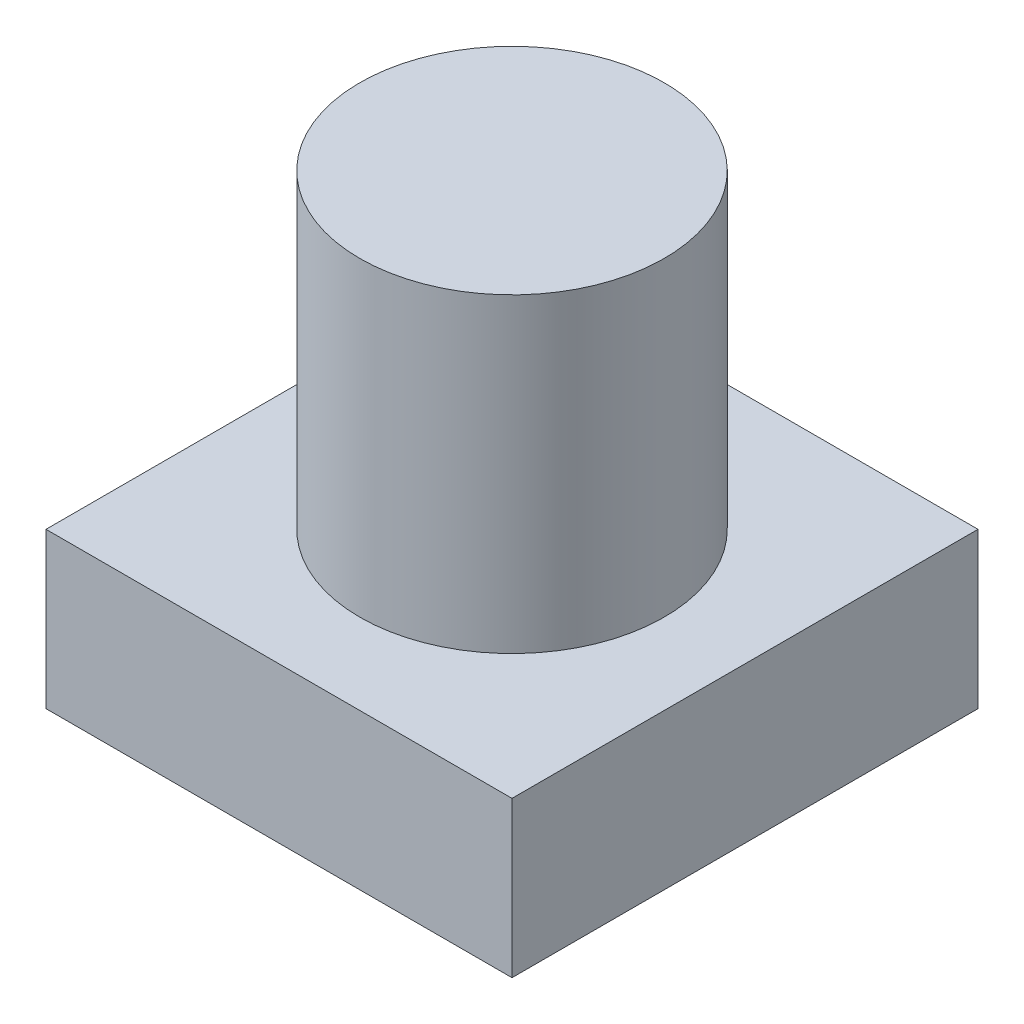
ISO-10303-21;
HEADER;
FILE_DESCRIPTION(('STEP AP214'),'2;1');
FILE_NAME('part.step','',(''),(''),'','','');
FILE_SCHEMA(('AUTOMOTIVE_DESIGN { 1 0 10303 214 1 1 1 1 }'));
ENDSEC;
DATA;
#1=APPLICATION_CONTEXT('core data for automotive mechanical design processes');
#2=APPLICATION_PROTOCOL_DEFINITION('international standard','automotive_design',2000,#1);
#3=PRODUCT_CONTEXT('',#1,'mechanical');
#4=PRODUCT('Part','Part','',(#3));
#5=PRODUCT_RELATED_PRODUCT_CATEGORY('part','',(#4));
#6=PRODUCT_DEFINITION_FORMATION('','',#4);
#7=PRODUCT_DEFINITION_CONTEXT('part definition',#1,'design');
#8=PRODUCT_DEFINITION('design','',#6,#7);
#9=PRODUCT_DEFINITION_SHAPE('','',#8);
#10=(LENGTH_UNIT() NAMED_UNIT(*) SI_UNIT(.MILLI.,.METRE.));
#11=(NAMED_UNIT(*) PLANE_ANGLE_UNIT() SI_UNIT($,.RADIAN.));
#12=(NAMED_UNIT(*) SI_UNIT($,.STERADIAN.) SOLID_ANGLE_UNIT());
#13=UNCERTAINTY_MEASURE_WITH_UNIT(LENGTH_MEASURE(1.E-05),#10,'distance_accuracy_value','');
#14=(GEOMETRIC_REPRESENTATION_CONTEXT(3) GLOBAL_UNCERTAINTY_ASSIGNED_CONTEXT((#13)) GLOBAL_UNIT_ASSIGNED_CONTEXT((#10,
#11,#12)) REPRESENTATION_CONTEXT('',''));
#15=CARTESIAN_POINT('',(0.,0.,0.));
#16=DIRECTION('',(0.,0.,1.));
#17=DIRECTION('',(1.,0.,0.));
#18=AXIS2_PLACEMENT_3D('',#15,#16,#17);
#19=CARTESIAN_POINT('',(7.5,5.,7.5));
#20=DIRECTION('',(-1.,0.,0.));
#21=DIRECTION('',(0.,0.,1.));
#22=AXIS2_PLACEMENT_3D('',#19,#20,#21);
#23=PLANE('',#22);
#24=DIRECTION('',(0.,0.,-1.));
#25=VECTOR('',#24,1.);
#26=CARTESIAN_POINT('',(7.5,0.,7.5));
#27=LINE('',#26,#25);
#28=CARTESIAN_POINT('',(7.5,0.,7.5));
#29=VERTEX_POINT('',#28);
#30=CARTESIAN_POINT('',(7.5,0.,-7.5));
#31=VERTEX_POINT('',#30);
#32=EDGE_CURVE('E110',#29,#31,#27,.T.);
#33=ORIENTED_EDGE('',*,*,#32,.T.);
#34=DIRECTION('',(0.,-1.,0.));
#35=VECTOR('',#34,1.);
#36=CARTESIAN_POINT('',(7.5,5.,-7.5));
#37=LINE('',#36,#35);
#38=CARTESIAN_POINT('',(7.5,5.,-7.5));
#39=VERTEX_POINT('',#38);
#40=EDGE_CURVE('E42',#39,#31,#37,.T.);
#41=ORIENTED_EDGE('',*,*,#40,.F.);
#42=DIRECTION('',(0.,0.,-1.));
#43=VECTOR('',#42,1.);
#44=CARTESIAN_POINT('',(7.5,5.,7.5));
#45=LINE('',#44,#43);
#46=CARTESIAN_POINT('',(7.5,5.,7.5));
#47=VERTEX_POINT('',#46);
#48=EDGE_CURVE('E93',#47,#39,#45,.T.);
#49=ORIENTED_EDGE('',*,*,#48,.F.);
#50=DIRECTION('',(0.,-1.,0.));
#51=VECTOR('',#50,1.);
#52=CARTESIAN_POINT('',(7.5,5.,7.5));
#53=LINE('',#52,#51);
#54=EDGE_CURVE('E106',#47,#29,#53,.T.);
#55=ORIENTED_EDGE('',*,*,#54,.T.);
#56=EDGE_LOOP('',(#33,#41,#49,#55));
#57=FACE_BOUND('',#56,.T.);
#58=ADVANCED_FACE('F39',(#57),#23,.F.);
#59=CARTESIAN_POINT('',(-7.5,5.,-7.5));
#60=DIRECTION('',(0.,0.,1.));
#61=DIRECTION('',(1.,0.,0.));
#62=AXIS2_PLACEMENT_3D('',#59,#60,#61);
#63=PLANE('',#62);
#64=DIRECTION('',(-1.,0.,0.));
#65=VECTOR('',#64,1.);
#66=CARTESIAN_POINT('',(-7.5,0.,-7.5));
#67=LINE('',#66,#65);
#68=CARTESIAN_POINT('',(-7.5,0.,-7.5));
#69=VERTEX_POINT('',#68);
#70=EDGE_CURVE('E99',#31,#69,#67,.T.);
#71=ORIENTED_EDGE('',*,*,#70,.T.);
#72=DIRECTION('',(0.,-1.,0.));
#73=VECTOR('',#72,1.);
#74=CARTESIAN_POINT('',(-7.5,5.,-7.5));
#75=LINE('',#74,#73);
#76=CARTESIAN_POINT('',(-7.5,5.,-7.5));
#77=VERTEX_POINT('',#76);
#78=EDGE_CURVE('E97',#77,#69,#75,.T.);
#79=ORIENTED_EDGE('',*,*,#78,.F.);
#80=DIRECTION('',(-1.,0.,0.));
#81=VECTOR('',#80,1.);
#82=CARTESIAN_POINT('',(-7.5,5.,-7.5));
#83=LINE('',#82,#81);
#84=EDGE_CURVE('E88',#39,#77,#83,.T.);
#85=ORIENTED_EDGE('',*,*,#84,.F.);
#86=ORIENTED_EDGE('',*,*,#40,.T.);
#87=EDGE_LOOP('',(#71,#79,#85,#86));
#88=FACE_BOUND('',#87,.T.);
#89=ADVANCED_FACE('F98',(#88),#63,.F.);
#90=CARTESIAN_POINT('',(-7.5,5.,7.5));
#91=DIRECTION('',(1.,0.,0.));
#92=DIRECTION('',(0.,0.,-1.));
#93=AXIS2_PLACEMENT_3D('',#90,#91,#92);
#94=PLANE('',#93);
#95=DIRECTION('',(0.,0.,1.));
#96=VECTOR('',#95,1.);
#97=CARTESIAN_POINT('',(-7.5,0.,7.5));
#98=LINE('',#97,#96);
#99=CARTESIAN_POINT('',(-7.5,0.,7.5));
#100=VERTEX_POINT('',#99);
#101=EDGE_CURVE('E74',#69,#100,#98,.T.);
#102=ORIENTED_EDGE('',*,*,#101,.T.);
#103=DIRECTION('',(0.,-1.,0.));
#104=VECTOR('',#103,1.);
#105=CARTESIAN_POINT('',(-7.5,5.,7.5));
#106=LINE('',#105,#104);
#107=CARTESIAN_POINT('',(-7.5,5.,7.5));
#108=VERTEX_POINT('',#107);
#109=EDGE_CURVE('E101',#108,#100,#106,.T.);
#110=ORIENTED_EDGE('',*,*,#109,.F.);
#111=DIRECTION('',(0.,0.,1.));
#112=VECTOR('',#111,1.);
#113=CARTESIAN_POINT('',(-7.5,5.,7.5));
#114=LINE('',#113,#112);
#115=EDGE_CURVE('E91',#77,#108,#114,.T.);
#116=ORIENTED_EDGE('',*,*,#115,.F.);
#117=ORIENTED_EDGE('',*,*,#78,.T.);
#118=EDGE_LOOP('',(#102,#110,#116,#117));
#119=FACE_BOUND('',#118,.T.);
#120=ADVANCED_FACE('F102',(#119),#94,.F.);
#121=CARTESIAN_POINT('',(-7.5,5.,7.5));
#122=DIRECTION('',(0.,0.,-1.));
#123=DIRECTION('',(-1.,0.,0.));
#124=AXIS2_PLACEMENT_3D('',#121,#122,#123);
#125=PLANE('',#124);
#126=DIRECTION('',(1.,0.,0.));
#127=VECTOR('',#126,1.);
#128=CARTESIAN_POINT('',(-7.5,0.,7.5));
#129=LINE('',#128,#127);
#130=EDGE_CURVE('E80',#100,#29,#129,.T.);
#131=ORIENTED_EDGE('',*,*,#130,.T.);
#132=ORIENTED_EDGE('',*,*,#54,.F.);
#133=DIRECTION('',(1.,0.,0.));
#134=VECTOR('',#133,1.);
#135=CARTESIAN_POINT('',(-7.5,5.,7.5));
#136=LINE('',#135,#134);
#137=EDGE_CURVE('E57',#108,#47,#136,.T.);
#138=ORIENTED_EDGE('',*,*,#137,.F.);
#139=ORIENTED_EDGE('',*,*,#109,.T.);
#140=EDGE_LOOP('',(#131,#132,#138,#139));
#141=FACE_BOUND('',#140,.T.);
#142=ADVANCED_FACE('F124',(#141),#125,.F.);
#143=CARTESIAN_POINT('',(0.,5.,0.));
#144=DIRECTION('',(0.,-1.,0.));
#145=DIRECTION('',(0.,0.,-1.));
#146=AXIS2_PLACEMENT_3D('',#143,#144,#145);
#147=PLANE('',#146);
#148=CARTESIAN_POINT('',(0.,5.,0.));
#149=DIRECTION('',(0.,1.,0.));
#150=DIRECTION('',(0.,0.,1.));
#151=AXIS2_PLACEMENT_3D('',#148,#149,#150);
#152=CIRCLE('',#151,4.9);
#153=CARTESIAN_POINT('',(0.,5.,4.9));
#154=VERTEX_POINT('',#153);
#155=EDGE_CURVE('E11',#154,#154,#152,.T.);
#156=ORIENTED_EDGE('',*,*,#155,.F.);
#157=EDGE_LOOP('',(#156));
#158=FACE_BOUND('',#157,.T.);
#159=ORIENTED_EDGE('',*,*,#48,.T.);
#160=ORIENTED_EDGE('',*,*,#84,.T.);
#161=ORIENTED_EDGE('',*,*,#115,.T.);
#162=ORIENTED_EDGE('',*,*,#137,.T.);
#163=EDGE_LOOP('',(#159,#160,#161,#162));
#164=FACE_BOUND('',#163,.T.);
#165=ADVANCED_FACE('F89',(#158,#164),#147,.F.);
#166=CARTESIAN_POINT('',(0.,0.,0.));
#167=DIRECTION('',(0.,-1.,0.));
#168=DIRECTION('',(0.,0.,-1.));
#169=AXIS2_PLACEMENT_3D('',#166,#167,#168);
#170=PLANE('',#169);
#171=ORIENTED_EDGE('',*,*,#32,.F.);
#172=ORIENTED_EDGE('',*,*,#130,.F.);
#173=ORIENTED_EDGE('',*,*,#101,.F.);
#174=ORIENTED_EDGE('',*,*,#70,.F.);
#175=EDGE_LOOP('',(#171,#172,#173,#174));
#176=FACE_BOUND('',#175,.T.);
#177=ADVANCED_FACE('F127',(#176),#170,.T.);
#178=CARTESIAN_POINT('',(0.,15.,0.));
#179=DIRECTION('',(0.,-1.,0.));
#180=DIRECTION('',(0.,0.,-1.));
#181=AXIS2_PLACEMENT_3D('',#178,#179,#180);
#182=CYLINDRICAL_SURFACE('',#181,4.9);
#183=CARTESIAN_POINT('',(0.,15.,0.));
#184=DIRECTION('',(0.,1.,0.));
#185=DIRECTION('',(0.,0.,1.));
#186=AXIS2_PLACEMENT_3D('',#183,#184,#185);
#187=CIRCLE('',#186,4.9);
#188=CARTESIAN_POINT('',(0.,15.,4.9));
#189=VERTEX_POINT('',#188);
#190=EDGE_CURVE('E114',#189,#189,#187,.T.);
#191=ORIENTED_EDGE('',*,*,#190,.F.);
#192=EDGE_LOOP('',(#191));
#193=FACE_BOUND('',#192,.T.);
#194=ORIENTED_EDGE('',*,*,#155,.T.);
#195=EDGE_LOOP('',(#194));
#196=FACE_BOUND('',#195,.T.);
#197=ADVANCED_FACE('F137',(#193,#196),#182,.T.);
#198=CARTESIAN_POINT('',(0.,15.,0.));
#199=DIRECTION('',(0.,1.,0.));
#200=DIRECTION('',(0.,0.,1.));
#201=AXIS2_PLACEMENT_3D('',#198,#199,#200);
#202=PLANE('',#201);
#203=ORIENTED_EDGE('',*,*,#190,.T.);
#204=EDGE_LOOP('',(#203));
#205=FACE_BOUND('',#204,.T.);
#206=ADVANCED_FACE('F135',(#205),#202,.T.);
#207=CLOSED_SHELL('',(#58,#89,#120,#142,#165,#177,#197,#206));
#208=MANIFOLD_SOLID_BREP('B2',#207);
#209=ADVANCED_BREP_SHAPE_REPRESENTATION('',(#18,#208),#14);
#210=SHAPE_DEFINITION_REPRESENTATION(#9,#209);
ENDSEC;
END-ISO-10303-21;
